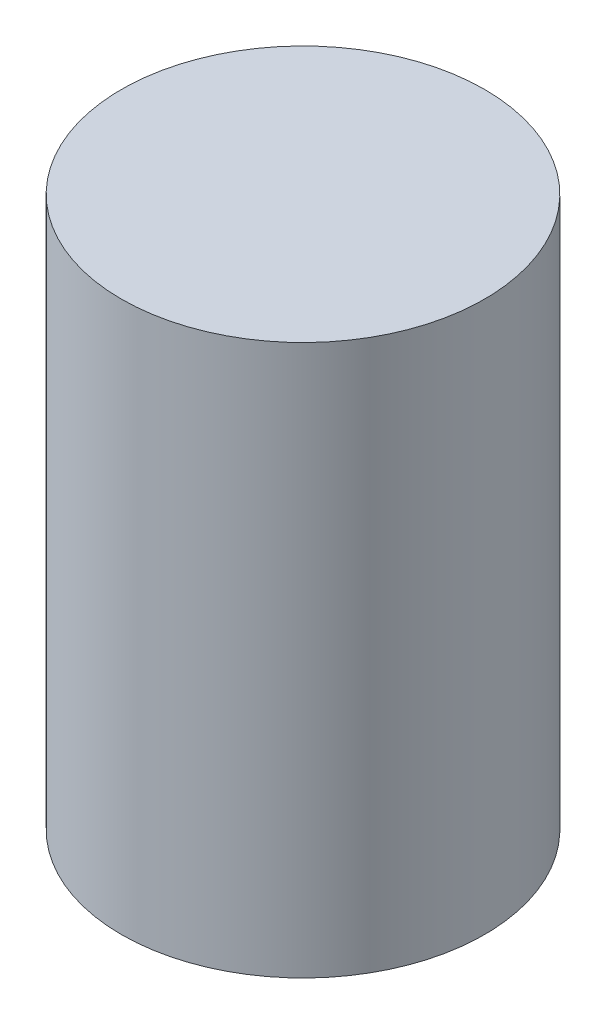
ISO-10303-21;
HEADER;
FILE_DESCRIPTION(('STEP AP214'),'2;1');
FILE_NAME('part.step','',(''),(''),'','','');
FILE_SCHEMA(('AUTOMOTIVE_DESIGN { 1 0 10303 214 1 1 1 1 }'));
ENDSEC;
DATA;
#1=APPLICATION_CONTEXT('core data for automotive mechanical design processes');
#2=APPLICATION_PROTOCOL_DEFINITION('international standard','automotive_design',2000,#1);
#3=PRODUCT_CONTEXT('',#1,'mechanical');
#4=PRODUCT('Part','Part','',(#3));
#5=PRODUCT_RELATED_PRODUCT_CATEGORY('part','',(#4));
#6=PRODUCT_DEFINITION_FORMATION('','',#4);
#7=PRODUCT_DEFINITION_CONTEXT('part definition',#1,'design');
#8=PRODUCT_DEFINITION('design','',#6,#7);
#9=PRODUCT_DEFINITION_SHAPE('','',#8);
#10=(LENGTH_UNIT() NAMED_UNIT(*) SI_UNIT(.MILLI.,.METRE.));
#11=(NAMED_UNIT(*) PLANE_ANGLE_UNIT() SI_UNIT($,.RADIAN.));
#12=(NAMED_UNIT(*) SI_UNIT($,.STERADIAN.) SOLID_ANGLE_UNIT());
#13=UNCERTAINTY_MEASURE_WITH_UNIT(LENGTH_MEASURE(1.E-05),#10,'distance_accuracy_value','');
#14=(GEOMETRIC_REPRESENTATION_CONTEXT(3) GLOBAL_UNCERTAINTY_ASSIGNED_CONTEXT((#13)) GLOBAL_UNIT_ASSIGNED_CONTEXT((#10,
#11,#12)) REPRESENTATION_CONTEXT('',''));
#15=CARTESIAN_POINT('',(0.,0.,0.));
#16=DIRECTION('',(0.,0.,1.));
#17=DIRECTION('',(1.,0.,0.));
#18=AXIS2_PLACEMENT_3D('',#15,#16,#17);
#19=CARTESIAN_POINT('',(0.,200.,0.));
#20=DIRECTION('',(0.,-1.,0.));
#21=DIRECTION('',(0.,0.,-1.));
#22=AXIS2_PLACEMENT_3D('',#19,#20,#21);
#23=CYLINDRICAL_SURFACE('',#22,66.);
#24=CARTESIAN_POINT('',(0.,200.,0.));
#25=DIRECTION('',(0.,1.,0.));
#26=DIRECTION('',(0.,0.,1.));
#27=AXIS2_PLACEMENT_3D('',#24,#25,#26);
#28=CIRCLE('',#27,66.);
#29=CARTESIAN_POINT('',(0.,200.,66.));
#30=VERTEX_POINT('',#29);
#31=EDGE_CURVE('E10',#30,#30,#28,.T.);
#32=ORIENTED_EDGE('',*,*,#31,.F.);
#33=EDGE_LOOP('',(#32));
#34=FACE_BOUND('',#33,.T.);
#35=CARTESIAN_POINT('',(0.,0.,0.));
#36=DIRECTION('',(0.,1.,0.));
#37=DIRECTION('',(0.,0.,1.));
#38=AXIS2_PLACEMENT_3D('',#35,#36,#37);
#39=CIRCLE('',#38,66.);
#40=CARTESIAN_POINT('',(0.,0.,66.));
#41=VERTEX_POINT('',#40);
#42=EDGE_CURVE('E36',#41,#41,#39,.T.);
#43=ORIENTED_EDGE('',*,*,#42,.T.);
#44=EDGE_LOOP('',(#43));
#45=FACE_BOUND('',#44,.T.);
#46=ADVANCED_FACE('F33',(#34,#45),#23,.T.);
#47=CARTESIAN_POINT('',(0.,200.,0.));
#48=DIRECTION('',(0.,1.,0.));
#49=DIRECTION('',(0.,0.,1.));
#50=AXIS2_PLACEMENT_3D('',#47,#48,#49);
#51=PLANE('',#50);
#52=ORIENTED_EDGE('',*,*,#31,.T.);
#53=EDGE_LOOP('',(#52));
#54=FACE_BOUND('',#53,.T.);
#55=ADVANCED_FACE('F48',(#54),#51,.T.);
#56=CARTESIAN_POINT('',(0.,0.,0.));
#57=DIRECTION('',(0.,1.,0.));
#58=DIRECTION('',(0.,0.,1.));
#59=AXIS2_PLACEMENT_3D('',#56,#57,#58);
#60=PLANE('',#59);
#61=ORIENTED_EDGE('',*,*,#42,.F.);
#62=EDGE_LOOP('',(#61));
#63=FACE_BOUND('',#62,.T.);
#64=ADVANCED_FACE('F46',(#63),#60,.F.);
#65=CLOSED_SHELL('',(#46,#55,#64));
#66=MANIFOLD_SOLID_BREP('B2',#65);
#67=ADVANCED_BREP_SHAPE_REPRESENTATION('',(#18,#66),#14);
#68=SHAPE_DEFINITION_REPRESENTATION(#9,#67);
ENDSEC;
END-ISO-10303-21;
